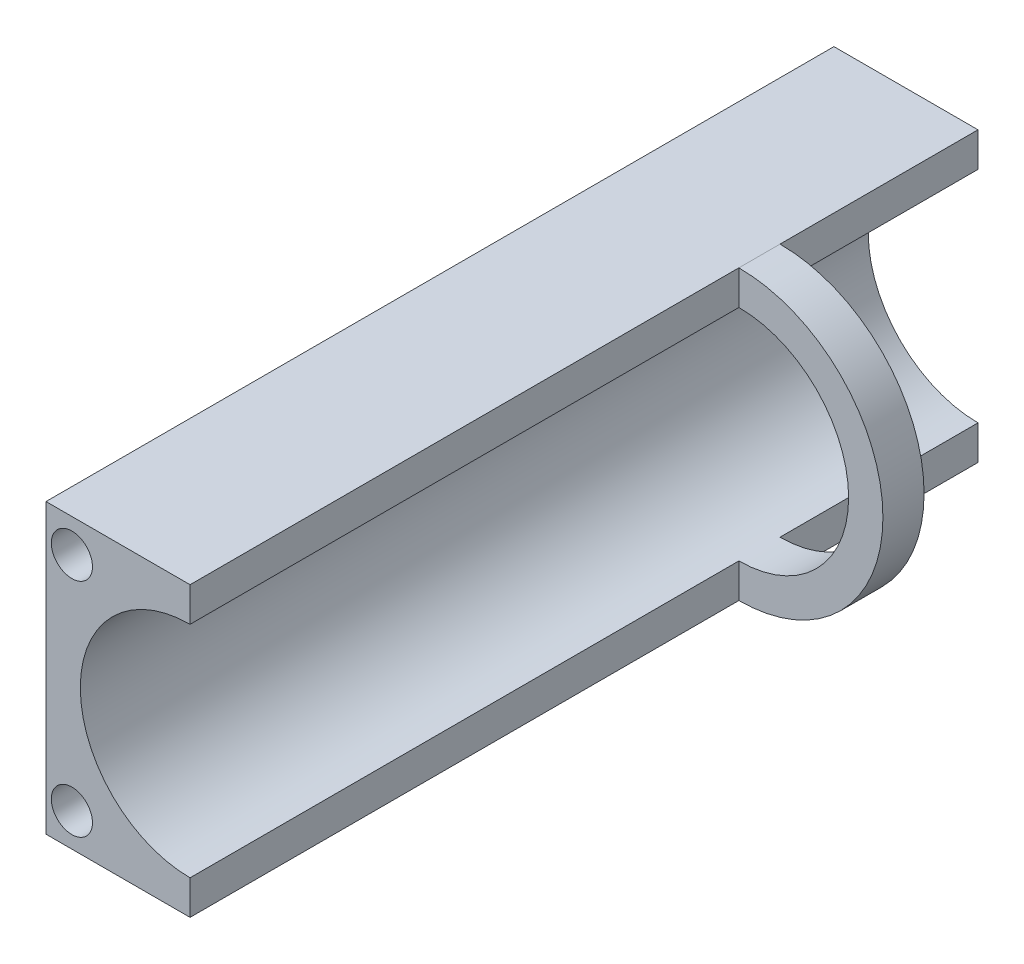
ISO-10303-21;
HEADER;
FILE_DESCRIPTION(('STEP AP214'),'2;1');
FILE_NAME('part.step','',(''),(''),'','','');
FILE_SCHEMA(('AUTOMOTIVE_DESIGN { 1 0 10303 214 1 1 1 1 }'));
ENDSEC;
DATA;
#1=APPLICATION_CONTEXT('core data for automotive mechanical design processes');
#2=APPLICATION_PROTOCOL_DEFINITION('international standard','automotive_design',2000,#1);
#3=PRODUCT_CONTEXT('',#1,'mechanical');
#4=PRODUCT('Part','Part','',(#3));
#5=PRODUCT_RELATED_PRODUCT_CATEGORY('part','',(#4));
#6=PRODUCT_DEFINITION_FORMATION('','',#4);
#7=PRODUCT_DEFINITION_CONTEXT('part definition',#1,'design');
#8=PRODUCT_DEFINITION('design','',#6,#7);
#9=PRODUCT_DEFINITION_SHAPE('','',#8);
#10=(LENGTH_UNIT() NAMED_UNIT(*) SI_UNIT(.MILLI.,.METRE.));
#11=(NAMED_UNIT(*) PLANE_ANGLE_UNIT() SI_UNIT($,.RADIAN.));
#12=(NAMED_UNIT(*) SI_UNIT($,.STERADIAN.) SOLID_ANGLE_UNIT());
#13=UNCERTAINTY_MEASURE_WITH_UNIT(LENGTH_MEASURE(1.E-05),#10,'distance_accuracy_value','');
#14=(GEOMETRIC_REPRESENTATION_CONTEXT(3) GLOBAL_UNCERTAINTY_ASSIGNED_CONTEXT((#13)) GLOBAL_UNIT_ASSIGNED_CONTEXT((#10,
#11,#12)) REPRESENTATION_CONTEXT('',''));
#15=CARTESIAN_POINT('',(0.,0.,0.));
#16=DIRECTION('',(0.,0.,1.));
#17=DIRECTION('',(1.,0.,0.));
#18=AXIS2_PLACEMENT_3D('',#15,#16,#17);
#19=CARTESIAN_POINT('',(0.,-8.,57.43));
#20=DIRECTION('',(-1.,0.,0.));
#21=DIRECTION('',(0.,-1.,0.));
#22=AXIS2_PLACEMENT_3D('',#19,#20,#21);
#23=PLANE('',#22);
#24=DIRECTION('',(0.,1.,0.));
#25=VECTOR('',#24,1.);
#26=CARTESIAN_POINT('',(0.,-8.,14.43));
#27=LINE('',#26,#25);
#28=CARTESIAN_POINT('',(0.,-10.5,14.43));
#29=VERTEX_POINT('',#28);
#30=CARTESIAN_POINT('',(0.,-8.,14.43));
#31=VERTEX_POINT('',#30);
#32=EDGE_CURVE('E178',#29,#31,#27,.T.);
#33=ORIENTED_EDGE('',*,*,#32,.F.);
#34=DIRECTION('',(0.,0.,-1.));
#35=VECTOR('',#34,1.);
#36=CARTESIAN_POINT('',(0.,-10.5,57.43));
#37=LINE('',#36,#35);
#38=CARTESIAN_POINT('',(0.,-10.5,0.));
#39=VERTEX_POINT('',#38);
#40=EDGE_CURVE('E43',#29,#39,#37,.T.);
#41=ORIENTED_EDGE('',*,*,#40,.T.);
#42=DIRECTION('',(0.,1.,0.));
#43=VECTOR('',#42,1.);
#44=CARTESIAN_POINT('',(0.,-8.,0.));
#45=LINE('',#44,#43);
#46=CARTESIAN_POINT('',(0.,-8.,0.));
#47=VERTEX_POINT('',#46);
#48=EDGE_CURVE('E198',#39,#47,#45,.T.);
#49=ORIENTED_EDGE('',*,*,#48,.T.);
#50=DIRECTION('',(0.,0.,-1.));
#51=VECTOR('',#50,1.);
#52=CARTESIAN_POINT('',(0.,-8.,57.43));
#53=LINE('',#52,#51);
#54=EDGE_CURVE('E57',#31,#47,#53,.T.);
#55=ORIENTED_EDGE('',*,*,#54,.F.);
#56=EDGE_LOOP('',(#33,#41,#49,#55));
#57=FACE_BOUND('',#56,.T.);
#58=ADVANCED_FACE('F35',(#57),#23,.F.);
#59=DIRECTION('',(0.,-1.,0.));
#60=VECTOR('',#59,1.);
#61=CARTESIAN_POINT('',(0.,-8.,17.43));
#62=LINE('',#61,#60);
#63=CARTESIAN_POINT('',(0.,-8.,17.43));
#64=VERTEX_POINT('',#63);
#65=CARTESIAN_POINT('',(0.,-10.5,17.43));
#66=VERTEX_POINT('',#65);
#67=EDGE_CURVE('E172',#64,#66,#62,.T.);
#68=ORIENTED_EDGE('',*,*,#67,.F.);
#69=CARTESIAN_POINT('',(0.,-8.,57.43));
#70=VERTEX_POINT('',#69);
#71=EDGE_CURVE('E221',#70,#64,#53,.T.);
#72=ORIENTED_EDGE('',*,*,#71,.F.);
#73=DIRECTION('',(0.,1.,0.));
#74=VECTOR('',#73,1.);
#75=CARTESIAN_POINT('',(0.,-8.,57.43));
#76=LINE('',#75,#74);
#77=CARTESIAN_POINT('',(0.,-10.5,57.43));
#78=VERTEX_POINT('',#77);
#79=EDGE_CURVE('E184',#78,#70,#76,.T.);
#80=ORIENTED_EDGE('',*,*,#79,.F.);
#81=EDGE_CURVE('E11',#78,#66,#37,.T.);
#82=ORIENTED_EDGE('',*,*,#81,.T.);
#83=EDGE_LOOP('',(#68,#72,#80,#82));
#84=FACE_BOUND('',#83,.T.);
#85=ADVANCED_FACE('F274',(#84),#23,.F.);
#86=CARTESIAN_POINT('',(0.,10.5,57.43));
#87=DIRECTION('',(-1.,0.,0.));
#88=DIRECTION('',(0.,-1.,0.));
#89=AXIS2_PLACEMENT_3D('',#86,#87,#88);
#90=PLANE('',#89);
#91=DIRECTION('',(0.,1.,0.));
#92=VECTOR('',#91,1.);
#93=CARTESIAN_POINT('',(0.,10.5,14.43));
#94=LINE('',#93,#92);
#95=CARTESIAN_POINT('',(0.,8.,14.43));
#96=VERTEX_POINT('',#95);
#97=CARTESIAN_POINT('',(0.,10.5,14.43));
#98=VERTEX_POINT('',#97);
#99=EDGE_CURVE('E175',#96,#98,#94,.T.);
#100=ORIENTED_EDGE('',*,*,#99,.F.);
#101=DIRECTION('',(0.,0.,-1.));
#102=VECTOR('',#101,1.);
#103=CARTESIAN_POINT('',(0.,8.,57.43));
#104=LINE('',#103,#102);
#105=CARTESIAN_POINT('',(0.,8.,0.));
#106=VERTEX_POINT('',#105);
#107=EDGE_CURVE('E218',#96,#106,#104,.T.);
#108=ORIENTED_EDGE('',*,*,#107,.T.);
#109=DIRECTION('',(0.,1.,0.));
#110=VECTOR('',#109,1.);
#111=CARTESIAN_POINT('',(0.,10.5,0.));
#112=LINE('',#111,#110);
#113=CARTESIAN_POINT('',(0.,10.5,0.));
#114=VERTEX_POINT('',#113);
#115=EDGE_CURVE('E203',#106,#114,#112,.T.);
#116=ORIENTED_EDGE('',*,*,#115,.T.);
#117=DIRECTION('',(0.,0.,-1.));
#118=VECTOR('',#117,1.);
#119=CARTESIAN_POINT('',(0.,10.5,57.43));
#120=LINE('',#119,#118);
#121=EDGE_CURVE('E214',#98,#114,#120,.T.);
#122=ORIENTED_EDGE('',*,*,#121,.F.);
#123=EDGE_LOOP('',(#100,#108,#116,#122));
#124=FACE_BOUND('',#123,.T.);
#125=ADVANCED_FACE('F241',(#124),#90,.F.);
#126=DIRECTION('',(0.,-1.,0.));
#127=VECTOR('',#126,1.);
#128=CARTESIAN_POINT('',(0.,10.5,17.43));
#129=LINE('',#128,#127);
#130=CARTESIAN_POINT('',(0.,10.5,17.43));
#131=VERTEX_POINT('',#130);
#132=CARTESIAN_POINT('',(0.,8.,17.43));
#133=VERTEX_POINT('',#132);
#134=EDGE_CURVE('E170',#131,#133,#129,.T.);
#135=ORIENTED_EDGE('',*,*,#134,.F.);
#136=CARTESIAN_POINT('',(0.,10.5,57.43));
#137=VERTEX_POINT('',#136);
#138=EDGE_CURVE('E215',#137,#131,#120,.T.);
#139=ORIENTED_EDGE('',*,*,#138,.F.);
#140=DIRECTION('',(0.,1.,0.));
#141=VECTOR('',#140,1.);
#142=CARTESIAN_POINT('',(0.,10.5,57.43));
#143=LINE('',#142,#141);
#144=CARTESIAN_POINT('',(0.,8.,57.43));
#145=VERTEX_POINT('',#144);
#146=EDGE_CURVE('E189',#145,#137,#143,.T.);
#147=ORIENTED_EDGE('',*,*,#146,.F.);
#148=EDGE_CURVE('E219',#145,#133,#104,.T.);
#149=ORIENTED_EDGE('',*,*,#148,.T.);
#150=EDGE_LOOP('',(#135,#139,#147,#149));
#151=FACE_BOUND('',#150,.T.);
#152=ADVANCED_FACE('F253',(#151),#90,.F.);
#153=CARTESIAN_POINT('',(-10.5,-10.5,57.43));
#154=DIRECTION('',(0.,1.,0.));
#155=DIRECTION('',(-1.,0.,0.));
#156=AXIS2_PLACEMENT_3D('',#153,#154,#155);
#157=PLANE('',#156);
#158=DIRECTION('',(1.,0.,0.));
#159=VECTOR('',#158,1.);
#160=CARTESIAN_POINT('',(-10.5,-10.5,0.));
#161=LINE('',#160,#159);
#162=CARTESIAN_POINT('',(-10.5,-10.5,0.));
#163=VERTEX_POINT('',#162);
#164=EDGE_CURVE('E180',#163,#39,#161,.T.);
#165=ORIENTED_EDGE('',*,*,#164,.T.);
#166=ORIENTED_EDGE('',*,*,#40,.F.);
#167=DIRECTION('',(0.,0.,-1.));
#168=VECTOR('',#167,1.);
#169=CARTESIAN_POINT('',(0.,-10.5,0.));
#170=LINE('',#169,#168);
#171=EDGE_CURVE('E50',#66,#29,#170,.T.);
#172=ORIENTED_EDGE('',*,*,#171,.F.);
#173=ORIENTED_EDGE('',*,*,#81,.F.);
#174=DIRECTION('',(1.,0.,0.));
#175=VECTOR('',#174,1.);
#176=CARTESIAN_POINT('',(-10.5,-10.5,57.43));
#177=LINE('',#176,#175);
#178=CARTESIAN_POINT('',(-10.5,-10.5,57.43));
#179=VERTEX_POINT('',#178);
#180=EDGE_CURVE('E181',#179,#78,#177,.T.);
#181=ORIENTED_EDGE('',*,*,#180,.F.);
#182=DIRECTION('',(0.,0.,-1.));
#183=VECTOR('',#182,1.);
#184=CARTESIAN_POINT('',(-10.5,-10.5,57.43));
#185=LINE('',#184,#183);
#186=EDGE_CURVE('E195',#179,#163,#185,.T.);
#187=ORIENTED_EDGE('',*,*,#186,.T.);
#188=EDGE_LOOP('',(#165,#166,#172,#173,#181,#187));
#189=FACE_BOUND('',#188,.T.);
#190=ADVANCED_FACE('F37',(#189),#157,.F.);
#191=CARTESIAN_POINT('',(0.,0.,57.43));
#192=DIRECTION('',(0.,0.,-1.));
#193=DIRECTION('',(-1.,0.,0.));
#194=AXIS2_PLACEMENT_3D('',#191,#192,#193);
#195=CYLINDRICAL_SURFACE('',#194,8.);
#196=ORIENTED_EDGE('',*,*,#71,.T.);
#197=CARTESIAN_POINT('',(0.,0.,17.43));
#198=DIRECTION('',(0.,0.,-1.));
#199=DIRECTION('',(-1.,0.,0.));
#200=AXIS2_PLACEMENT_3D('',#197,#198,#199);
#201=CIRCLE('',#200,8.);
#202=EDGE_CURVE('E161',#133,#64,#201,.T.);
#203=ORIENTED_EDGE('',*,*,#202,.F.);
#204=ORIENTED_EDGE('',*,*,#148,.F.);
#205=CARTESIAN_POINT('',(0.,0.,57.43));
#206=DIRECTION('',(0.,0.,-1.));
#207=DIRECTION('',(1.,0.,0.));
#208=AXIS2_PLACEMENT_3D('',#205,#206,#207);
#209=CIRCLE('',#208,8.);
#210=EDGE_CURVE('E187',#70,#145,#209,.T.);
#211=ORIENTED_EDGE('',*,*,#210,.F.);
#212=EDGE_LOOP('',(#196,#203,#204,#211));
#213=FACE_BOUND('',#212,.T.);
#214=CARTESIAN_POINT('',(0.,0.,14.43));
#215=DIRECTION('',(0.,0.,-1.));
#216=DIRECTION('',(-1.,0.,0.));
#217=AXIS2_PLACEMENT_3D('',#214,#215,#216);
#218=CIRCLE('',#217,8.);
#219=EDGE_CURVE('E164',#96,#31,#218,.T.);
#220=ORIENTED_EDGE('',*,*,#219,.T.);
#221=ORIENTED_EDGE('',*,*,#54,.T.);
#222=CARTESIAN_POINT('',(0.,0.,0.));
#223=DIRECTION('',(0.,0.,-1.));
#224=DIRECTION('',(1.,0.,0.));
#225=AXIS2_PLACEMENT_3D('',#222,#223,#224);
#226=CIRCLE('',#225,8.);
#227=EDGE_CURVE('E200',#47,#106,#226,.T.);
#228=ORIENTED_EDGE('',*,*,#227,.T.);
#229=ORIENTED_EDGE('',*,*,#107,.F.);
#230=EDGE_LOOP('',(#220,#221,#228,#229));
#231=FACE_BOUND('',#230,.T.);
#232=ADVANCED_FACE('F228',(#213,#231),#195,.F.);
#233=CARTESIAN_POINT('',(0.,10.5,57.43));
#234=DIRECTION('',(0.,-1.,0.));
#235=DIRECTION('',(1.,0.,0.));
#236=AXIS2_PLACEMENT_3D('',#233,#234,#235);
#237=PLANE('',#236);
#238=DIRECTION('',(-1.,0.,0.));
#239=VECTOR('',#238,1.);
#240=CARTESIAN_POINT('',(0.,10.5,0.));
#241=LINE('',#240,#239);
#242=CARTESIAN_POINT('',(-10.5,10.5,0.));
#243=VERTEX_POINT('',#242);
#244=EDGE_CURVE('E206',#114,#243,#241,.T.);
#245=ORIENTED_EDGE('',*,*,#244,.T.);
#246=DIRECTION('',(0.,0.,-1.));
#247=VECTOR('',#246,1.);
#248=CARTESIAN_POINT('',(-10.5,10.5,57.43));
#249=LINE('',#248,#247);
#250=CARTESIAN_POINT('',(-10.5,10.5,57.43));
#251=VERTEX_POINT('',#250);
#252=EDGE_CURVE('E211',#251,#243,#249,.T.);
#253=ORIENTED_EDGE('',*,*,#252,.F.);
#254=DIRECTION('',(-1.,0.,0.));
#255=VECTOR('',#254,1.);
#256=CARTESIAN_POINT('',(0.,10.5,57.43));
#257=LINE('',#256,#255);
#258=EDGE_CURVE('E191',#137,#251,#257,.T.);
#259=ORIENTED_EDGE('',*,*,#258,.F.);
#260=ORIENTED_EDGE('',*,*,#138,.T.);
#261=DIRECTION('',(0.,0.,-1.));
#262=VECTOR('',#261,1.);
#263=CARTESIAN_POINT('',(0.,10.5,0.));
#264=LINE('',#263,#262);
#265=EDGE_CURVE('E167',#98,#131,#264,.F.);
#266=ORIENTED_EDGE('',*,*,#265,.F.);
#267=ORIENTED_EDGE('',*,*,#121,.T.);
#268=EDGE_LOOP('',(#245,#253,#259,#260,#266,#267));
#269=FACE_BOUND('',#268,.T.);
#270=ADVANCED_FACE('F258',(#269),#237,.F.);
#271=CARTESIAN_POINT('',(-10.5,10.5,57.43));
#272=DIRECTION('',(1.,0.,0.));
#273=DIRECTION('',(0.,1.,0.));
#274=AXIS2_PLACEMENT_3D('',#271,#272,#273);
#275=PLANE('',#274);
#276=DIRECTION('',(0.,-1.,0.));
#277=VECTOR('',#276,1.);
#278=CARTESIAN_POINT('',(-10.5,10.5,0.));
#279=LINE('',#278,#277);
#280=EDGE_CURVE('E185',#243,#163,#279,.T.);
#281=ORIENTED_EDGE('',*,*,#280,.T.);
#282=ORIENTED_EDGE('',*,*,#186,.F.);
#283=DIRECTION('',(0.,-1.,0.));
#284=VECTOR('',#283,1.);
#285=CARTESIAN_POINT('',(-10.5,10.5,57.43));
#286=LINE('',#285,#284);
#287=EDGE_CURVE('E193',#251,#179,#286,.T.);
#288=ORIENTED_EDGE('',*,*,#287,.F.);
#289=ORIENTED_EDGE('',*,*,#252,.T.);
#290=EDGE_LOOP('',(#281,#282,#288,#289));
#291=FACE_BOUND('',#290,.T.);
#292=ADVANCED_FACE('F270',(#291),#275,.F.);
#293=CARTESIAN_POINT('',(0.,0.,57.43));
#294=DIRECTION('',(0.,0.,1.));
#295=DIRECTION('',(1.,0.,0.));
#296=AXIS2_PLACEMENT_3D('',#293,#294,#295);
#297=PLANE('',#296);
#298=CARTESIAN_POINT('',(-8.61334429823863,8.08,57.43));
#299=DIRECTION('',(0.,0.,1.));
#300=DIRECTION('',(1.,0.,0.));
#301=AXIS2_PLACEMENT_3D('',#298,#299,#300);
#302=CIRCLE('',#301,1.5);
#303=CARTESIAN_POINT('',(-7.11334429823863,8.08,57.43));
#304=VERTEX_POINT('',#303);
#305=EDGE_CURVE('E149',#304,#304,#302,.T.);
#306=ORIENTED_EDGE('',*,*,#305,.F.);
#307=EDGE_LOOP('',(#306));
#308=FACE_BOUND('',#307,.T.);
#309=CARTESIAN_POINT('',(-8.61334429823863,-8.08,57.43));
#310=DIRECTION('',(0.,0.,1.));
#311=DIRECTION('',(1.,0.,0.));
#312=AXIS2_PLACEMENT_3D('',#309,#310,#311);
#313=CIRCLE('',#312,1.5);
#314=CARTESIAN_POINT('',(-7.11334429823863,-8.08,57.43));
#315=VERTEX_POINT('',#314);
#316=EDGE_CURVE('E152',#315,#315,#313,.T.);
#317=ORIENTED_EDGE('',*,*,#316,.F.);
#318=EDGE_LOOP('',(#317));
#319=FACE_BOUND('',#318,.T.);
#320=ORIENTED_EDGE('',*,*,#180,.T.);
#321=ORIENTED_EDGE('',*,*,#79,.T.);
#322=ORIENTED_EDGE('',*,*,#210,.T.);
#323=ORIENTED_EDGE('',*,*,#146,.T.);
#324=ORIENTED_EDGE('',*,*,#258,.T.);
#325=ORIENTED_EDGE('',*,*,#287,.T.);
#326=EDGE_LOOP('',(#320,#321,#322,#323,#324,#325));
#327=FACE_BOUND('',#326,.T.);
#328=ADVANCED_FACE('F262',(#308,#319,#327),#297,.T.);
#329=CARTESIAN_POINT('',(0.,0.,0.));
#330=DIRECTION('',(0.,0.,1.));
#331=DIRECTION('',(1.,0.,0.));
#332=AXIS2_PLACEMENT_3D('',#329,#330,#331);
#333=PLANE('',#332);
#334=CARTESIAN_POINT('',(-8.61334429823864,-8.08,0.));
#335=DIRECTION('',(0.,0.,-1.));
#336=DIRECTION('',(-1.,0.,0.));
#337=AXIS2_PLACEMENT_3D('',#334,#335,#336);
#338=CIRCLE('',#337,1.5);
#339=CARTESIAN_POINT('',(-10.1133442982386,-8.08,0.));
#340=VERTEX_POINT('',#339);
#341=EDGE_CURVE('E143',#340,#340,#338,.T.);
#342=ORIENTED_EDGE('',*,*,#341,.F.);
#343=EDGE_LOOP('',(#342));
#344=FACE_BOUND('',#343,.T.);
#345=CARTESIAN_POINT('',(-8.61334429823864,8.08,0.));
#346=DIRECTION('',(0.,0.,-1.));
#347=DIRECTION('',(-1.,0.,0.));
#348=AXIS2_PLACEMENT_3D('',#345,#346,#347);
#349=CIRCLE('',#348,1.5);
#350=CARTESIAN_POINT('',(-10.1133442982386,8.08,0.));
#351=VERTEX_POINT('',#350);
#352=EDGE_CURVE('E146',#351,#351,#349,.T.);
#353=ORIENTED_EDGE('',*,*,#352,.F.);
#354=EDGE_LOOP('',(#353));
#355=FACE_BOUND('',#354,.T.);
#356=ORIENTED_EDGE('',*,*,#164,.F.);
#357=ORIENTED_EDGE('',*,*,#280,.F.);
#358=ORIENTED_EDGE('',*,*,#244,.F.);
#359=ORIENTED_EDGE('',*,*,#115,.F.);
#360=ORIENTED_EDGE('',*,*,#227,.F.);
#361=ORIENTED_EDGE('',*,*,#48,.F.);
#362=EDGE_LOOP('',(#356,#357,#358,#359,#360,#361));
#363=FACE_BOUND('',#362,.T.);
#364=ADVANCED_FACE('F235',(#344,#355,#363),#333,.F.);
#365=CARTESIAN_POINT('',(0.,-10.5,14.43));
#366=DIRECTION('',(0.,0.,1.));
#367=DIRECTION('',(1.,0.,0.));
#368=AXIS2_PLACEMENT_3D('',#365,#366,#367);
#369=PLANE('',#368);
#370=CARTESIAN_POINT('',(0.,0.,14.43));
#371=DIRECTION('',(0.,0.,-1.));
#372=DIRECTION('',(-1.,0.,0.));
#373=AXIS2_PLACEMENT_3D('',#370,#371,#372);
#374=CIRCLE('',#373,10.5);
#375=EDGE_CURVE('E155',#98,#29,#374,.T.);
#376=ORIENTED_EDGE('',*,*,#375,.T.);
#377=ORIENTED_EDGE('',*,*,#32,.T.);
#378=ORIENTED_EDGE('',*,*,#219,.F.);
#379=ORIENTED_EDGE('',*,*,#99,.T.);
#380=EDGE_LOOP('',(#376,#377,#378,#379));
#381=FACE_BOUND('',#380,.T.);
#382=ADVANCED_FACE('F244',(#381),#369,.F.);
#383=CARTESIAN_POINT('',(0.,-10.5,17.43));
#384=DIRECTION('',(0.,0.,-1.));
#385=DIRECTION('',(-1.,0.,0.));
#386=AXIS2_PLACEMENT_3D('',#383,#384,#385);
#387=PLANE('',#386);
#388=ORIENTED_EDGE('',*,*,#202,.T.);
#389=ORIENTED_EDGE('',*,*,#67,.T.);
#390=CARTESIAN_POINT('',(0.,0.,17.43));
#391=DIRECTION('',(0.,0.,-1.));
#392=DIRECTION('',(-1.,0.,0.));
#393=AXIS2_PLACEMENT_3D('',#390,#391,#392);
#394=CIRCLE('',#393,10.5);
#395=EDGE_CURVE('E158',#131,#66,#394,.T.);
#396=ORIENTED_EDGE('',*,*,#395,.F.);
#397=ORIENTED_EDGE('',*,*,#134,.T.);
#398=EDGE_LOOP('',(#388,#389,#396,#397));
#399=FACE_BOUND('',#398,.T.);
#400=ADVANCED_FACE('F250',(#399),#387,.F.);
#401=CARTESIAN_POINT('',(0.,0.,0.));
#402=DIRECTION('',(0.,0.,-1.));
#403=DIRECTION('',(-1.,0.,0.));
#404=AXIS2_PLACEMENT_3D('',#401,#402,#403);
#405=CYLINDRICAL_SURFACE('',#404,10.5);
#406=ORIENTED_EDGE('',*,*,#395,.T.);
#407=ORIENTED_EDGE('',*,*,#171,.T.);
#408=ORIENTED_EDGE('',*,*,#375,.F.);
#409=ORIENTED_EDGE('',*,*,#265,.T.);
#410=EDGE_LOOP('',(#406,#407,#408,#409));
#411=FACE_BOUND('',#410,.T.);
#412=ADVANCED_FACE('F246',(#411),#405,.T.);
#413=CARTESIAN_POINT('',(-8.61334429823863,-8.08,57.33));
#414=DIRECTION('',(0.,0.,1.));
#415=DIRECTION('',(1.,0.,0.));
#416=AXIS2_PLACEMENT_3D('',#413,#414,#415);
#417=CYLINDRICAL_SURFACE('',#416,1.5);
#418=ORIENTED_EDGE('',*,*,#316,.T.);
#419=EDGE_LOOP('',(#418));
#420=FACE_BOUND('',#419,.T.);
#421=CARTESIAN_POINT('',(-8.61334429823863,-8.08,54.43));
#422=DIRECTION('',(0.,0.,1.));
#423=DIRECTION('',(1.,0.,0.));
#424=AXIS2_PLACEMENT_3D('',#421,#422,#423);
#425=CIRCLE('',#424,1.49999999999999);
#426=CARTESIAN_POINT('',(-7.11334429823864,-8.08,54.43));
#427=VERTEX_POINT('',#426);
#428=EDGE_CURVE('E140',#427,#427,#425,.T.);
#429=ORIENTED_EDGE('',*,*,#428,.F.);
#430=EDGE_LOOP('',(#429));
#431=FACE_BOUND('',#430,.T.);
#432=ADVANCED_FACE('F301',(#420,#431),#417,.F.);
#433=CARTESIAN_POINT('',(-8.61334429823863,8.08,57.33));
#434=DIRECTION('',(0.,0.,1.));
#435=DIRECTION('',(1.,0.,0.));
#436=AXIS2_PLACEMENT_3D('',#433,#434,#435);
#437=CYLINDRICAL_SURFACE('',#436,1.5);
#438=ORIENTED_EDGE('',*,*,#305,.T.);
#439=EDGE_LOOP('',(#438));
#440=FACE_BOUND('',#439,.T.);
#441=CARTESIAN_POINT('',(-8.61334429823863,8.08,54.43));
#442=DIRECTION('',(0.,0.,1.));
#443=DIRECTION('',(1.,0.,0.));
#444=AXIS2_PLACEMENT_3D('',#441,#442,#443);
#445=CIRCLE('',#444,1.49999999999999);
#446=CARTESIAN_POINT('',(-7.11334429823864,8.08,54.43));
#447=VERTEX_POINT('',#446);
#448=EDGE_CURVE('E135',#447,#447,#445,.T.);
#449=ORIENTED_EDGE('',*,*,#448,.F.);
#450=EDGE_LOOP('',(#449));
#451=FACE_BOUND('',#450,.T.);
#452=ADVANCED_FACE('F304',(#440,#451),#437,.F.);
#453=CARTESIAN_POINT('',(-8.61334429823864,8.08,0.1));
#454=DIRECTION('',(0.,0.,-1.));
#455=DIRECTION('',(-1.,0.,0.));
#456=AXIS2_PLACEMENT_3D('',#453,#454,#455);
#457=CYLINDRICAL_SURFACE('',#456,1.5);
#458=ORIENTED_EDGE('',*,*,#352,.T.);
#459=EDGE_LOOP('',(#458));
#460=FACE_BOUND('',#459,.T.);
#461=CARTESIAN_POINT('',(-8.61334429823864,8.08,3.));
#462=DIRECTION('',(0.,0.,-1.));
#463=DIRECTION('',(-1.,0.,0.));
#464=AXIS2_PLACEMENT_3D('',#461,#462,#463);
#465=CIRCLE('',#464,1.49999999999999);
#466=CARTESIAN_POINT('',(-10.1133442982386,8.08,3.));
#467=VERTEX_POINT('',#466);
#468=EDGE_CURVE('E130',#467,#467,#465,.T.);
#469=ORIENTED_EDGE('',*,*,#468,.F.);
#470=EDGE_LOOP('',(#469));
#471=FACE_BOUND('',#470,.T.);
#472=ADVANCED_FACE('F308',(#460,#471),#457,.F.);
#473=CARTESIAN_POINT('',(-8.61334429823864,-8.08,0.1));
#474=DIRECTION('',(0.,0.,-1.));
#475=DIRECTION('',(-1.,0.,0.));
#476=AXIS2_PLACEMENT_3D('',#473,#474,#475);
#477=CYLINDRICAL_SURFACE('',#476,1.5);
#478=ORIENTED_EDGE('',*,*,#341,.T.);
#479=EDGE_LOOP('',(#478));
#480=FACE_BOUND('',#479,.T.);
#481=CARTESIAN_POINT('',(-8.61334429823864,-8.08,3.));
#482=DIRECTION('',(0.,0.,-1.));
#483=DIRECTION('',(-1.,0.,0.));
#484=AXIS2_PLACEMENT_3D('',#481,#482,#483);
#485=CIRCLE('',#484,1.49999999999999);
#486=CARTESIAN_POINT('',(-10.1133442982386,-8.08,3.));
#487=VERTEX_POINT('',#486);
#488=EDGE_CURVE('E132',#487,#487,#485,.T.);
#489=ORIENTED_EDGE('',*,*,#488,.F.);
#490=EDGE_LOOP('',(#489));
#491=FACE_BOUND('',#490,.T.);
#492=ADVANCED_FACE('F312',(#480,#491),#477,.F.);
#493=CARTESIAN_POINT('',(-8.61334429823863,-8.08,54.43));
#494=DIRECTION('',(0.,0.,1.));
#495=DIRECTION('',(1.,0.,0.));
#496=AXIS2_PLACEMENT_3D('',#493,#494,#495);
#497=CONICAL_SURFACE('',#496,1.49999999999999,1.02974425867665);
#498=CARTESIAN_POINT('',(-8.61334429823863,-8.08,53.5287090714587));
#499=VERTEX_POINT('',#498);
#500=VERTEX_LOOP('',#499);
#501=FACE_BOUND('',#500,.T.);
#502=ORIENTED_EDGE('',*,*,#428,.T.);
#503=EDGE_LOOP('',(#502));
#504=FACE_BOUND('',#503,.T.);
#505=ADVANCED_FACE('F316',(#501,#504),#497,.F.);
#506=CARTESIAN_POINT('',(-8.61334429823863,8.08,54.43));
#507=DIRECTION('',(0.,0.,1.));
#508=DIRECTION('',(1.,0.,0.));
#509=AXIS2_PLACEMENT_3D('',#506,#507,#508);
#510=CONICAL_SURFACE('',#509,1.49999999999999,1.02974425867665);
#511=CARTESIAN_POINT('',(-8.61334429823863,8.08,53.5287090714587));
#512=VERTEX_POINT('',#511);
#513=VERTEX_LOOP('',#512);
#514=FACE_BOUND('',#513,.T.);
#515=ORIENTED_EDGE('',*,*,#448,.T.);
#516=EDGE_LOOP('',(#515));
#517=FACE_BOUND('',#516,.T.);
#518=ADVANCED_FACE('F320',(#514,#517),#510,.F.);
#519=CARTESIAN_POINT('',(-8.61334429823864,-8.08,3.));
#520=DIRECTION('',(0.,0.,-1.));
#521=DIRECTION('',(-1.,0.,0.));
#522=AXIS2_PLACEMENT_3D('',#519,#520,#521);
#523=CONICAL_SURFACE('',#522,1.49999999999999,1.02974425867665);
#524=CARTESIAN_POINT('',(-8.61334429823864,-8.08,3.90129092854134));
#525=VERTEX_POINT('',#524);
#526=VERTEX_LOOP('',#525);
#527=FACE_BOUND('',#526,.T.);
#528=ORIENTED_EDGE('',*,*,#488,.T.);
#529=EDGE_LOOP('',(#528));
#530=FACE_BOUND('',#529,.T.);
#531=ADVANCED_FACE('F126',(#527,#530),#523,.F.);
#532=CARTESIAN_POINT('',(-8.61334429823864,8.08,3.));
#533=DIRECTION('',(0.,0.,-1.));
#534=DIRECTION('',(-1.,0.,0.));
#535=AXIS2_PLACEMENT_3D('',#532,#533,#534);
#536=CONICAL_SURFACE('',#535,1.49999999999999,1.02974425867665);
#537=CARTESIAN_POINT('',(-8.61334429823864,8.08,3.90129092854134));
#538=VERTEX_POINT('',#537);
#539=VERTEX_LOOP('',#538);
#540=FACE_BOUND('',#539,.T.);
#541=ORIENTED_EDGE('',*,*,#468,.T.);
#542=EDGE_LOOP('',(#541));
#543=FACE_BOUND('',#542,.T.);
#544=ADVANCED_FACE('F123',(#540,#543),#536,.F.);
#545=CLOSED_SHELL('',(#58,#85,#125,#152,#190,#232,#270,#292,#328,#364,#382,#400,#412,#432,#452,
#472,#492,#505,#518,#531,#544));
#546=MANIFOLD_SOLID_BREP('B2',#545);
#547=ADVANCED_BREP_SHAPE_REPRESENTATION('',(#18,#546),#14);
#548=SHAPE_DEFINITION_REPRESENTATION(#9,#547);
ENDSEC;
END-ISO-10303-21;
